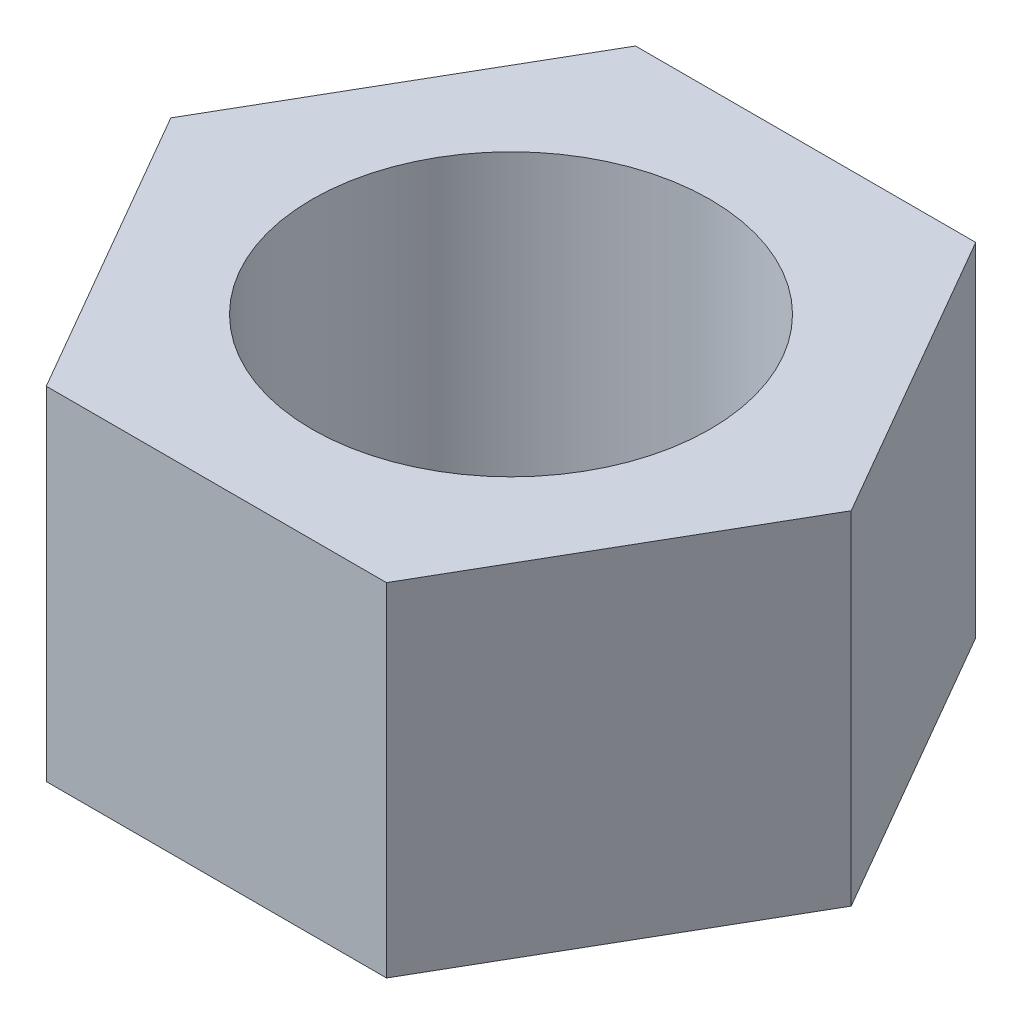
ISO-10303-21;
HEADER;
FILE_DESCRIPTION(('STEP AP214'),'2;1');
FILE_NAME('part.step','',(''),(''),'','','');
FILE_SCHEMA(('AUTOMOTIVE_DESIGN { 1 0 10303 214 1 1 1 1 }'));
ENDSEC;
DATA;
#1=APPLICATION_CONTEXT('core data for automotive mechanical design processes');
#2=APPLICATION_PROTOCOL_DEFINITION('international standard','automotive_design',2000,#1);
#3=PRODUCT_CONTEXT('',#1,'mechanical');
#4=PRODUCT('Part','Part','',(#3));
#5=PRODUCT_RELATED_PRODUCT_CATEGORY('part','',(#4));
#6=PRODUCT_DEFINITION_FORMATION('','',#4);
#7=PRODUCT_DEFINITION_CONTEXT('part definition',#1,'design');
#8=PRODUCT_DEFINITION('design','',#6,#7);
#9=PRODUCT_DEFINITION_SHAPE('','',#8);
#10=(LENGTH_UNIT() NAMED_UNIT(*) SI_UNIT(.MILLI.,.METRE.));
#11=(NAMED_UNIT(*) PLANE_ANGLE_UNIT() SI_UNIT($,.RADIAN.));
#12=(NAMED_UNIT(*) SI_UNIT($,.STERADIAN.) SOLID_ANGLE_UNIT());
#13=UNCERTAINTY_MEASURE_WITH_UNIT(LENGTH_MEASURE(1.E-05),#10,'distance_accuracy_value','');
#14=(GEOMETRIC_REPRESENTATION_CONTEXT(3) GLOBAL_UNCERTAINTY_ASSIGNED_CONTEXT((#13)) GLOBAL_UNIT_ASSIGNED_CONTEXT((#10,
#11,#12)) REPRESENTATION_CONTEXT('',''));
#15=CARTESIAN_POINT('',(0.,0.,0.));
#16=DIRECTION('',(0.,0.,1.));
#17=DIRECTION('',(1.,0.,0.));
#18=AXIS2_PLACEMENT_3D('',#15,#16,#17);
#19=CARTESIAN_POINT('',(-5.42593782984411,10.922,9.39799999999999));
#20=DIRECTION('',(0.,0.,-1.));
#21=DIRECTION('',(-1.,0.,0.));
#22=AXIS2_PLACEMENT_3D('',#19,#20,#21);
#23=PLANE('',#22);
#24=DIRECTION('',(1.,0.,0.));
#25=VECTOR('',#24,1.);
#26=CARTESIAN_POINT('',(-5.42593782984411,0.,9.39799999999999));
#27=LINE('',#26,#25);
#28=CARTESIAN_POINT('',(-5.42593782984411,0.,9.39799999999999));
#29=VERTEX_POINT('',#28);
#30=CARTESIAN_POINT('',(5.4259378298441,0.,9.39799999999999));
#31=VERTEX_POINT('',#30);
#32=EDGE_CURVE('E116',#29,#31,#27,.T.);
#33=ORIENTED_EDGE('',*,*,#32,.T.);
#34=DIRECTION('',(0.,-1.,0.));
#35=VECTOR('',#34,1.);
#36=CARTESIAN_POINT('',(5.4259378298441,10.922,9.39799999999999));
#37=LINE('',#36,#35);
#38=CARTESIAN_POINT('',(5.4259378298441,10.922,9.39799999999999));
#39=VERTEX_POINT('',#38);
#40=EDGE_CURVE('E11',#39,#31,#37,.T.);
#41=ORIENTED_EDGE('',*,*,#40,.F.);
#42=DIRECTION('',(1.,0.,0.));
#43=VECTOR('',#42,1.);
#44=CARTESIAN_POINT('',(-5.42593782984411,10.922,9.39799999999999));
#45=LINE('',#44,#43);
#46=CARTESIAN_POINT('',(-5.42593782984411,10.922,9.39799999999999));
#47=VERTEX_POINT('',#46);
#48=EDGE_CURVE('E127',#47,#39,#45,.T.);
#49=ORIENTED_EDGE('',*,*,#48,.F.);
#50=DIRECTION('',(0.,-1.,0.));
#51=VECTOR('',#50,1.);
#52=CARTESIAN_POINT('',(-5.42593782984411,10.922,9.39799999999999));
#53=LINE('',#52,#51);
#54=EDGE_CURVE('E112',#47,#29,#53,.T.);
#55=ORIENTED_EDGE('',*,*,#54,.T.);
#56=EDGE_LOOP('',(#33,#41,#49,#55));
#57=FACE_BOUND('',#56,.T.);
#58=ADVANCED_FACE('F32',(#57),#23,.F.);
#59=CARTESIAN_POINT('',(5.4259378298441,10.922,9.39799999999999));
#60=DIRECTION('',(-0.866025403784439,0.,-0.5));
#61=DIRECTION('',(-0.5,0.,0.866025403784439));
#62=AXIS2_PLACEMENT_3D('',#59,#60,#61);
#63=PLANE('',#62);
#64=DIRECTION('',(0.5,0.,-0.866025403784439));
#65=VECTOR('',#64,1.);
#66=CARTESIAN_POINT('',(5.4259378298441,0.,9.39799999999999));
#67=LINE('',#66,#65);
#68=CARTESIAN_POINT('',(10.8518756596882,0.,0.));
#69=VERTEX_POINT('',#68);
#70=EDGE_CURVE('E119',#31,#69,#67,.T.);
#71=ORIENTED_EDGE('',*,*,#70,.T.);
#72=DIRECTION('',(0.,-1.,0.));
#73=VECTOR('',#72,1.);
#74=CARTESIAN_POINT('',(10.8518756596882,10.922,0.));
#75=LINE('',#74,#73);
#76=CARTESIAN_POINT('',(10.8518756596882,10.922,0.));
#77=VERTEX_POINT('',#76);
#78=EDGE_CURVE('E40',#77,#69,#75,.T.);
#79=ORIENTED_EDGE('',*,*,#78,.F.);
#80=DIRECTION('',(0.5,0.,-0.866025403784439));
#81=VECTOR('',#80,1.);
#82=CARTESIAN_POINT('',(5.4259378298441,10.922,9.39799999999999));
#83=LINE('',#82,#81);
#84=EDGE_CURVE('E85',#39,#77,#83,.T.);
#85=ORIENTED_EDGE('',*,*,#84,.F.);
#86=ORIENTED_EDGE('',*,*,#40,.T.);
#87=EDGE_LOOP('',(#71,#79,#85,#86));
#88=FACE_BOUND('',#87,.T.);
#89=ADVANCED_FACE('F152',(#88),#63,.F.);
#90=CARTESIAN_POINT('',(10.8518756596882,10.922,0.));
#91=DIRECTION('',(-0.866025403784438,0.,0.5));
#92=DIRECTION('',(0.5,0.,0.866025403784438));
#93=AXIS2_PLACEMENT_3D('',#90,#91,#92);
#94=PLANE('',#93);
#95=DIRECTION('',(-0.5,0.,-0.866025403784438));
#96=VECTOR('',#95,1.);
#97=CARTESIAN_POINT('',(10.8518756596882,0.,0.));
#98=LINE('',#97,#96);
#99=CARTESIAN_POINT('',(5.42593782984409,0.,-9.398));
#100=VERTEX_POINT('',#99);
#101=EDGE_CURVE('E122',#69,#100,#98,.T.);
#102=ORIENTED_EDGE('',*,*,#101,.T.);
#103=DIRECTION('',(0.,-1.,0.));
#104=VECTOR('',#103,1.);
#105=CARTESIAN_POINT('',(5.42593782984409,10.922,-9.398));
#106=LINE('',#105,#104);
#107=CARTESIAN_POINT('',(5.42593782984409,10.922,-9.398));
#108=VERTEX_POINT('',#107);
#109=EDGE_CURVE('E107',#108,#100,#106,.T.);
#110=ORIENTED_EDGE('',*,*,#109,.F.);
#111=DIRECTION('',(-0.5,0.,-0.866025403784438));
#112=VECTOR('',#111,1.);
#113=CARTESIAN_POINT('',(10.8518756596882,10.922,0.));
#114=LINE('',#113,#112);
#115=EDGE_CURVE('E98',#77,#108,#114,.T.);
#116=ORIENTED_EDGE('',*,*,#115,.F.);
#117=ORIENTED_EDGE('',*,*,#78,.T.);
#118=EDGE_LOOP('',(#102,#110,#116,#117));
#119=FACE_BOUND('',#118,.T.);
#120=ADVANCED_FACE('F133',(#119),#94,.F.);
#121=CARTESIAN_POINT('',(5.42593782984409,10.922,-9.398));
#122=DIRECTION('',(0.,0.,1.));
#123=DIRECTION('',(1.,0.,0.));
#124=AXIS2_PLACEMENT_3D('',#121,#122,#123);
#125=PLANE('',#124);
#126=DIRECTION('',(-1.,0.,0.));
#127=VECTOR('',#126,1.);
#128=CARTESIAN_POINT('',(5.42593782984409,0.,-9.398));
#129=LINE('',#128,#127);
#130=CARTESIAN_POINT('',(-5.42593782984411,0.,-9.398));
#131=VERTEX_POINT('',#130);
#132=EDGE_CURVE('E106',#100,#131,#129,.T.);
#133=ORIENTED_EDGE('',*,*,#132,.T.);
#134=DIRECTION('',(0.,-1.,0.));
#135=VECTOR('',#134,1.);
#136=CARTESIAN_POINT('',(-5.42593782984411,10.922,-9.398));
#137=LINE('',#136,#135);
#138=CARTESIAN_POINT('',(-5.42593782984411,10.922,-9.398));
#139=VERTEX_POINT('',#138);
#140=EDGE_CURVE('E103',#139,#131,#137,.T.);
#141=ORIENTED_EDGE('',*,*,#140,.F.);
#142=DIRECTION('',(-1.,0.,0.));
#143=VECTOR('',#142,1.);
#144=CARTESIAN_POINT('',(5.42593782984409,10.922,-9.398));
#145=LINE('',#144,#143);
#146=EDGE_CURVE('E92',#108,#139,#145,.T.);
#147=ORIENTED_EDGE('',*,*,#146,.F.);
#148=ORIENTED_EDGE('',*,*,#109,.T.);
#149=EDGE_LOOP('',(#133,#141,#147,#148));
#150=FACE_BOUND('',#149,.T.);
#151=ADVANCED_FACE('F104',(#150),#125,.F.);
#152=CARTESIAN_POINT('',(-5.42593782984411,10.922,-9.398));
#153=DIRECTION('',(0.866025403784439,0.,0.5));
#154=DIRECTION('',(0.5,0.,-0.866025403784439));
#155=AXIS2_PLACEMENT_3D('',#152,#153,#154);
#156=PLANE('',#155);
#157=DIRECTION('',(-0.5,0.,0.866025403784439));
#158=VECTOR('',#157,1.);
#159=CARTESIAN_POINT('',(-5.42593782984411,0.,-9.398));
#160=LINE('',#159,#158);
#161=CARTESIAN_POINT('',(-10.8518756596882,0.,0.));
#162=VERTEX_POINT('',#161);
#163=EDGE_CURVE('E71',#131,#162,#160,.T.);
#164=ORIENTED_EDGE('',*,*,#163,.T.);
#165=DIRECTION('',(0.,-1.,0.));
#166=VECTOR('',#165,1.);
#167=CARTESIAN_POINT('',(-10.8518756596882,10.922,0.));
#168=LINE('',#167,#166);
#169=CARTESIAN_POINT('',(-10.8518756596882,10.922,0.));
#170=VERTEX_POINT('',#169);
#171=EDGE_CURVE('E108',#170,#162,#168,.T.);
#172=ORIENTED_EDGE('',*,*,#171,.F.);
#173=DIRECTION('',(-0.5,0.,0.866025403784439));
#174=VECTOR('',#173,1.);
#175=CARTESIAN_POINT('',(-5.42593782984411,10.922,-9.398));
#176=LINE('',#175,#174);
#177=EDGE_CURVE('E96',#139,#170,#176,.T.);
#178=ORIENTED_EDGE('',*,*,#177,.F.);
#179=ORIENTED_EDGE('',*,*,#140,.T.);
#180=EDGE_LOOP('',(#164,#172,#178,#179));
#181=FACE_BOUND('',#180,.T.);
#182=ADVANCED_FACE('F110',(#181),#156,.F.);
#183=CARTESIAN_POINT('',(-10.8518756596882,10.922,0.));
#184=DIRECTION('',(0.866025403784439,0.,-0.5));
#185=DIRECTION('',(-0.5,0.,-0.866025403784439));
#186=AXIS2_PLACEMENT_3D('',#183,#184,#185);
#187=PLANE('',#186);
#188=DIRECTION('',(0.5,0.,0.866025403784438));
#189=VECTOR('',#188,1.);
#190=CARTESIAN_POINT('',(-10.8518756596882,0.,0.));
#191=LINE('',#190,#189);
#192=EDGE_CURVE('E77',#162,#29,#191,.T.);
#193=ORIENTED_EDGE('',*,*,#192,.T.);
#194=ORIENTED_EDGE('',*,*,#54,.F.);
#195=DIRECTION('',(0.5,0.,0.866025403784438));
#196=VECTOR('',#195,1.);
#197=CARTESIAN_POINT('',(-10.8518756596882,10.922,0.));
#198=LINE('',#197,#196);
#199=EDGE_CURVE('E48',#170,#47,#198,.T.);
#200=ORIENTED_EDGE('',*,*,#199,.F.);
#201=ORIENTED_EDGE('',*,*,#171,.T.);
#202=EDGE_LOOP('',(#193,#194,#200,#201));
#203=FACE_BOUND('',#202,.T.);
#204=ADVANCED_FACE('F140',(#203),#187,.F.);
#205=CARTESIAN_POINT('',(0.,10.922,0.));
#206=DIRECTION('',(0.,1.,0.));
#207=DIRECTION('',(0.,0.,1.));
#208=AXIS2_PLACEMENT_3D('',#205,#206,#207);
#209=PLANE('',#208);
#210=CARTESIAN_POINT('',(0.,10.922,0.));
#211=DIRECTION('',(0.,1.,0.));
#212=DIRECTION('',(0.,0.,1.));
#213=AXIS2_PLACEMENT_3D('',#210,#211,#212);
#214=CIRCLE('',#213,6.35);
#215=CARTESIAN_POINT('',(0.,10.922,6.35));
#216=VERTEX_POINT('',#215);
#217=EDGE_CURVE('E207',#216,#216,#214,.T.);
#218=ORIENTED_EDGE('',*,*,#217,.F.);
#219=EDGE_LOOP('',(#218));
#220=FACE_BOUND('',#219,.T.);
#221=ORIENTED_EDGE('',*,*,#48,.T.);
#222=ORIENTED_EDGE('',*,*,#84,.T.);
#223=ORIENTED_EDGE('',*,*,#115,.T.);
#224=ORIENTED_EDGE('',*,*,#146,.T.);
#225=ORIENTED_EDGE('',*,*,#177,.T.);
#226=ORIENTED_EDGE('',*,*,#199,.T.);
#227=EDGE_LOOP('',(#221,#222,#223,#224,#225,#226));
#228=FACE_BOUND('',#227,.T.);
#229=ADVANCED_FACE('F94',(#220,#228),#209,.T.);
#230=CARTESIAN_POINT('',(0.,0.,0.));
#231=DIRECTION('',(0.,1.,0.));
#232=DIRECTION('',(0.,0.,1.));
#233=AXIS2_PLACEMENT_3D('',#230,#231,#232);
#234=PLANE('',#233);
#235=CARTESIAN_POINT('',(0.,0.,0.));
#236=DIRECTION('',(0.,1.,0.));
#237=DIRECTION('',(0.,0.,1.));
#238=AXIS2_PLACEMENT_3D('',#235,#236,#237);
#239=CIRCLE('',#238,6.35);
#240=CARTESIAN_POINT('',(0.,0.,6.35));
#241=VERTEX_POINT('',#240);
#242=EDGE_CURVE('E120',#241,#241,#239,.T.);
#243=ORIENTED_EDGE('',*,*,#242,.T.);
#244=EDGE_LOOP('',(#243));
#245=FACE_BOUND('',#244,.T.);
#246=ORIENTED_EDGE('',*,*,#32,.F.);
#247=ORIENTED_EDGE('',*,*,#192,.F.);
#248=ORIENTED_EDGE('',*,*,#163,.F.);
#249=ORIENTED_EDGE('',*,*,#132,.F.);
#250=ORIENTED_EDGE('',*,*,#101,.F.);
#251=ORIENTED_EDGE('',*,*,#70,.F.);
#252=EDGE_LOOP('',(#246,#247,#248,#249,#250,#251));
#253=FACE_BOUND('',#252,.T.);
#254=ADVANCED_FACE('F136',(#245,#253),#234,.F.);
#255=CARTESIAN_POINT('',(0.,0.,0.));
#256=DIRECTION('',(0.,1.,0.));
#257=DIRECTION('',(0.,0.,1.));
#258=AXIS2_PLACEMENT_3D('',#255,#256,#257);
#259=CYLINDRICAL_SURFACE('',#258,6.35);
#260=ORIENTED_EDGE('',*,*,#242,.F.);
#261=EDGE_LOOP('',(#260));
#262=FACE_BOUND('',#261,.T.);
#263=ORIENTED_EDGE('',*,*,#217,.T.);
#264=EDGE_LOOP('',(#263));
#265=FACE_BOUND('',#264,.T.);
#266=ADVANCED_FACE('F189',(#262,#265),#259,.F.);
#267=CLOSED_SHELL('',(#58,#89,#120,#151,#182,#204,#229,#254,#266));
#268=MANIFOLD_SOLID_BREP('B2',#267);
#269=ADVANCED_BREP_SHAPE_REPRESENTATION('',(#18,#268),#14);
#270=SHAPE_DEFINITION_REPRESENTATION(#9,#269);
ENDSEC;
END-ISO-10303-21;
